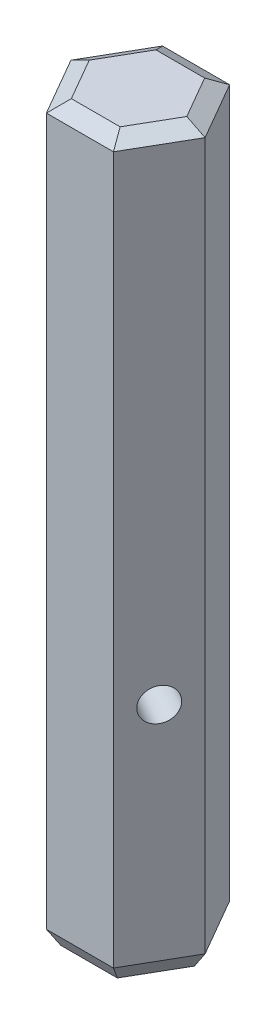
ISO-10303-21;
HEADER;
FILE_DESCRIPTION(('STEP AP214'),'2;1');
FILE_NAME('part.step','',(''),(''),'','','');
FILE_SCHEMA(('AUTOMOTIVE_DESIGN { 1 0 10303 214 1 1 1 1 }'));
ENDSEC;
DATA;
#1=APPLICATION_CONTEXT('core data for automotive mechanical design processes');
#2=APPLICATION_PROTOCOL_DEFINITION('international standard','automotive_design',2000,#1);
#3=PRODUCT_CONTEXT('',#1,'mechanical');
#4=PRODUCT('Part','Part','',(#3));
#5=PRODUCT_RELATED_PRODUCT_CATEGORY('part','',(#4));
#6=PRODUCT_DEFINITION_FORMATION('','',#4);
#7=PRODUCT_DEFINITION_CONTEXT('part definition',#1,'design');
#8=PRODUCT_DEFINITION('design','',#6,#7);
#9=PRODUCT_DEFINITION_SHAPE('','',#8);
#10=(LENGTH_UNIT() NAMED_UNIT(*) SI_UNIT(.MILLI.,.METRE.));
#11=(NAMED_UNIT(*) PLANE_ANGLE_UNIT() SI_UNIT($,.RADIAN.));
#12=(NAMED_UNIT(*) SI_UNIT($,.STERADIAN.) SOLID_ANGLE_UNIT());
#13=UNCERTAINTY_MEASURE_WITH_UNIT(LENGTH_MEASURE(1.E-05),#10,'distance_accuracy_value','');
#14=(GEOMETRIC_REPRESENTATION_CONTEXT(3) GLOBAL_UNCERTAINTY_ASSIGNED_CONTEXT((#13)) GLOBAL_UNIT_ASSIGNED_CONTEXT((#10,
#11,#12)) REPRESENTATION_CONTEXT('',''));
#15=CARTESIAN_POINT('',(0.,0.,0.));
#16=DIRECTION('',(0.,0.,1.));
#17=DIRECTION('',(1.,0.,0.));
#18=AXIS2_PLACEMENT_3D('',#15,#16,#17);
#19=CARTESIAN_POINT('',(1.8330871046771,40.,3.17499999999998));
#20=DIRECTION('',(-0.866025403784442,0.,-0.499999999999995));
#21=DIRECTION('',(-0.499999999999995,0.,0.866025403784442));
#22=AXIS2_PLACEMENT_3D('',#19,#20,#21);
#23=PLANE('',#22);
#24=CARTESIAN_POINT('',(2.74963065701561,13.,1.58749999999999));
#25=DIRECTION('',(0.866025403784441,0.,0.499999999999995));
#26=DIRECTION('',(0.499999999999995,0.,-0.866025403784442));
#27=AXIS2_PLACEMENT_3D('',#24,#25,#26);
#28=CIRCLE('',#27,0.9);
#29=CARTESIAN_POINT('',(3.19963065701561,13.,0.808077136593995));
#30=VERTEX_POINT('',#29);
#31=EDGE_CURVE('E549',#30,#30,#28,.T.);
#32=ORIENTED_EDGE('',*,*,#31,.F.);
#33=EDGE_LOOP('',(#32));
#34=FACE_BOUND('',#33,.T.);
#35=DIRECTION('',(0.,-1.,0.));
#36=VECTOR('',#35,1.);
#37=CARTESIAN_POINT('',(3.66617420935413,40.,0.));
#38=LINE('',#37,#36);
#39=CARTESIAN_POINT('',(3.66617420935413,39.5,0.));
#40=VERTEX_POINT('',#39);
#41=CARTESIAN_POINT('',(3.66617420935413,0.866025403784436,0.));
#42=VERTEX_POINT('',#41);
#43=EDGE_CURVE('E150',#40,#42,#38,.T.);
#44=ORIENTED_EDGE('',*,*,#43,.F.);
#45=DIRECTION('',(-0.499999999999995,0.,0.866025403784442));
#46=VECTOR('',#45,1.);
#47=CARTESIAN_POINT('',(1.8330871046771,39.5,3.17499999999998));
#48=LINE('',#47,#46);
#49=CARTESIAN_POINT('',(1.8330871046771,39.5,3.17499999999998));
#50=VERTEX_POINT('',#49);
#51=EDGE_CURVE('E183',#40,#50,#48,.T.);
#52=ORIENTED_EDGE('',*,*,#51,.T.);
#53=DIRECTION('',(0.,-1.,0.));
#54=VECTOR('',#53,1.);
#55=CARTESIAN_POINT('',(1.8330871046771,40.,3.17499999999998));
#56=LINE('',#55,#54);
#57=CARTESIAN_POINT('',(1.8330871046771,0.866025403784436,3.17499999999998));
#58=VERTEX_POINT('',#57);
#59=EDGE_CURVE('E204',#50,#58,#56,.T.);
#60=ORIENTED_EDGE('',*,*,#59,.T.);
#61=DIRECTION('',(0.499999999999995,0.,-0.866025403784442));
#62=VECTOR('',#61,1.);
#63=CARTESIAN_POINT('',(1.8330871046771,0.866025403784436,3.17499999999998));
#64=LINE('',#63,#62);
#65=EDGE_CURVE('E181',#58,#42,#64,.T.);
#66=ORIENTED_EDGE('',*,*,#65,.T.);
#67=EDGE_LOOP('',(#44,#52,#60,#66));
#68=FACE_BOUND('',#67,.T.);
#69=ADVANCED_FACE('F39',(#34,#68),#23,.F.);
#70=CARTESIAN_POINT('',(3.66617420935413,40.,0.));
#71=DIRECTION('',(-0.866025403784438,0.,0.500000000000001));
#72=DIRECTION('',(0.500000000000001,0.,0.866025403784438));
#73=AXIS2_PLACEMENT_3D('',#70,#71,#72);
#74=PLANE('',#73);
#75=DIRECTION('',(0.,-1.,0.));
#76=VECTOR('',#75,1.);
#77=CARTESIAN_POINT('',(1.83308710467706,40.,-3.17500000000001));
#78=LINE('',#77,#76);
#79=CARTESIAN_POINT('',(1.83308710467706,39.5,-3.17500000000001));
#80=VERTEX_POINT('',#79);
#81=CARTESIAN_POINT('',(1.83308710467706,0.866025403784436,-3.17500000000001));
#82=VERTEX_POINT('',#81);
#83=EDGE_CURVE('E245',#80,#82,#78,.T.);
#84=ORIENTED_EDGE('',*,*,#83,.F.);
#85=DIRECTION('',(0.500000000000001,0.,0.866025403784438));
#86=VECTOR('',#85,1.);
#87=CARTESIAN_POINT('',(3.66617420935413,39.5,0.));
#88=LINE('',#87,#86);
#89=EDGE_CURVE('E179',#80,#40,#88,.T.);
#90=ORIENTED_EDGE('',*,*,#89,.T.);
#91=ORIENTED_EDGE('',*,*,#43,.T.);
#92=DIRECTION('',(-0.500000000000001,0.,-0.866025403784438));
#93=VECTOR('',#92,1.);
#94=CARTESIAN_POINT('',(3.66617420935413,0.866025403784436,0.));
#95=LINE('',#94,#93);
#96=EDGE_CURVE('E176',#42,#82,#95,.T.);
#97=ORIENTED_EDGE('',*,*,#96,.T.);
#98=EDGE_LOOP('',(#84,#90,#91,#97));
#99=FACE_BOUND('',#98,.T.);
#100=ADVANCED_FACE('F242',(#99),#74,.F.);
#101=CARTESIAN_POINT('',(1.83308710467706,40.,-3.17500000000001));
#102=DIRECTION('',(0.,0.,1.));
#103=DIRECTION('',(1.,0.,0.));
#104=AXIS2_PLACEMENT_3D('',#101,#102,#103);
#105=PLANE('',#104);
#106=DIRECTION('',(0.,-1.,0.));
#107=VECTOR('',#106,1.);
#108=CARTESIAN_POINT('',(-1.83308710467708,40.,-3.17499999999999));
#109=LINE('',#108,#107);
#110=CARTESIAN_POINT('',(-1.83308710467708,39.5,-3.17499999999999));
#111=VERTEX_POINT('',#110);
#112=CARTESIAN_POINT('',(-1.83308710467708,0.866025403784436,-3.17499999999999));
#113=VERTEX_POINT('',#112);
#114=EDGE_CURVE('E247',#111,#113,#109,.T.);
#115=ORIENTED_EDGE('',*,*,#114,.F.);
#116=DIRECTION('',(1.,0.,0.));
#117=VECTOR('',#116,1.);
#118=CARTESIAN_POINT('',(1.83308710467706,39.5,-3.17500000000001));
#119=LINE('',#118,#117);
#120=EDGE_CURVE('E174',#111,#80,#119,.T.);
#121=ORIENTED_EDGE('',*,*,#120,.T.);
#122=ORIENTED_EDGE('',*,*,#83,.T.);
#123=DIRECTION('',(-1.,0.,0.));
#124=VECTOR('',#123,1.);
#125=CARTESIAN_POINT('',(1.83308710467706,0.866025403784436,-3.17500000000001));
#126=LINE('',#125,#124);
#127=EDGE_CURVE('E172',#82,#113,#126,.T.);
#128=ORIENTED_EDGE('',*,*,#127,.T.);
#129=EDGE_LOOP('',(#115,#121,#122,#128));
#130=FACE_BOUND('',#129,.T.);
#131=ADVANCED_FACE('F310',(#130),#105,.F.);
#132=CARTESIAN_POINT('',(-1.83308710467708,40.,-3.17499999999999));
#133=DIRECTION('',(0.866025403784442,0.,0.499999999999995));
#134=DIRECTION('',(0.499999999999995,0.,-0.866025403784442));
#135=AXIS2_PLACEMENT_3D('',#132,#133,#134);
#136=PLANE('',#135);
#137=CARTESIAN_POINT('',(-2.7496306570156,13.,-1.58749999999998));
#138=DIRECTION('',(0.866025403784442,0.,0.499999999999995));
#139=DIRECTION('',(0.499999999999995,0.,-0.866025403784442));
#140=AXIS2_PLACEMENT_3D('',#137,#138,#139);
#141=CIRCLE('',#140,0.9);
#142=CARTESIAN_POINT('',(-2.29963065701561,13.,-2.36692286340598));
#143=VERTEX_POINT('',#142);
#144=EDGE_CURVE('E44',#143,#143,#141,.T.);
#145=ORIENTED_EDGE('',*,*,#144,.T.);
#146=EDGE_LOOP('',(#145));
#147=FACE_BOUND('',#146,.T.);
#148=DIRECTION('',(0.,-1.,0.));
#149=VECTOR('',#148,1.);
#150=CARTESIAN_POINT('',(-3.66617420935413,40.,0.));
#151=LINE('',#150,#149);
#152=CARTESIAN_POINT('',(-3.66617420935413,39.5,0.));
#153=VERTEX_POINT('',#152);
#154=CARTESIAN_POINT('',(-3.66617420935413,0.866025403784436,0.));
#155=VERTEX_POINT('',#154);
#156=EDGE_CURVE('E272',#153,#155,#151,.T.);
#157=ORIENTED_EDGE('',*,*,#156,.F.);
#158=DIRECTION('',(0.499999999999995,0.,-0.866025403784442));
#159=VECTOR('',#158,1.);
#160=CARTESIAN_POINT('',(-1.83308710467708,39.5,-3.17499999999999));
#161=LINE('',#160,#159);
#162=EDGE_CURVE('E170',#153,#111,#161,.T.);
#163=ORIENTED_EDGE('',*,*,#162,.T.);
#164=ORIENTED_EDGE('',*,*,#114,.T.);
#165=DIRECTION('',(-0.499999999999995,0.,0.866025403784442));
#166=VECTOR('',#165,1.);
#167=CARTESIAN_POINT('',(-1.83308710467708,0.866025403784436,-3.17499999999999));
#168=LINE('',#167,#166);
#169=EDGE_CURVE('E168',#113,#155,#168,.T.);
#170=ORIENTED_EDGE('',*,*,#169,.T.);
#171=EDGE_LOOP('',(#157,#163,#164,#170));
#172=FACE_BOUND('',#171,.T.);
#173=ADVANCED_FACE('F281',(#147,#172),#136,.F.);
#174=CARTESIAN_POINT('',(-3.66617420935413,40.,0.));
#175=DIRECTION('',(0.866025403784435,0.,-0.500000000000007));
#176=DIRECTION('',(-0.500000000000007,0.,-0.866025403784435));
#177=AXIS2_PLACEMENT_3D('',#174,#175,#176);
#178=PLANE('',#177);
#179=DIRECTION('',(0.,-1.,0.));
#180=VECTOR('',#179,1.);
#181=CARTESIAN_POINT('',(-1.83308710467703,40.,3.17500000000002));
#182=LINE('',#181,#180);
#183=CARTESIAN_POINT('',(-1.83308710467703,39.5,3.17500000000002));
#184=VERTEX_POINT('',#183);
#185=CARTESIAN_POINT('',(-1.83308710467703,0.866025403784436,3.17500000000002));
#186=VERTEX_POINT('',#185);
#187=EDGE_CURVE('E270',#184,#186,#182,.T.);
#188=ORIENTED_EDGE('',*,*,#187,.F.);
#189=DIRECTION('',(-0.500000000000007,0.,-0.866025403784435));
#190=VECTOR('',#189,1.);
#191=CARTESIAN_POINT('',(-3.66617420935413,39.5,0.));
#192=LINE('',#191,#190);
#193=EDGE_CURVE('E166',#184,#153,#192,.T.);
#194=ORIENTED_EDGE('',*,*,#193,.T.);
#195=ORIENTED_EDGE('',*,*,#156,.T.);
#196=DIRECTION('',(0.500000000000007,0.,0.866025403784435));
#197=VECTOR('',#196,1.);
#198=CARTESIAN_POINT('',(-3.66617420935413,0.866025403784436,0.));
#199=LINE('',#198,#197);
#200=EDGE_CURVE('E164',#155,#186,#199,.T.);
#201=ORIENTED_EDGE('',*,*,#200,.T.);
#202=EDGE_LOOP('',(#188,#194,#195,#201));
#203=FACE_BOUND('',#202,.T.);
#204=ADVANCED_FACE('F271',(#203),#178,.F.);
#205=CARTESIAN_POINT('',(-1.83308710467703,40.,3.17500000000002));
#206=DIRECTION('',(0.,0.,-1.));
#207=DIRECTION('',(-1.,0.,0.));
#208=AXIS2_PLACEMENT_3D('',#205,#206,#207);
#209=PLANE('',#208);
#210=ORIENTED_EDGE('',*,*,#59,.F.);
#211=DIRECTION('',(-1.,0.,0.));
#212=VECTOR('',#211,1.);
#213=CARTESIAN_POINT('',(-1.83308710467703,39.5,3.17500000000002));
#214=LINE('',#213,#212);
#215=EDGE_CURVE('E136',#50,#184,#214,.T.);
#216=ORIENTED_EDGE('',*,*,#215,.T.);
#217=ORIENTED_EDGE('',*,*,#187,.T.);
#218=DIRECTION('',(1.,0.,0.));
#219=VECTOR('',#218,1.);
#220=CARTESIAN_POINT('',(-1.83308710467703,0.866025403784436,3.17500000000002));
#221=LINE('',#220,#219);
#222=EDGE_CURVE('E156',#186,#58,#221,.T.);
#223=ORIENTED_EDGE('',*,*,#222,.T.);
#224=EDGE_LOOP('',(#210,#216,#217,#223));
#225=FACE_BOUND('',#224,.T.);
#226=ADVANCED_FACE('F269',(#225),#209,.F.);
#227=CARTESIAN_POINT('',(0.,40.,0.));
#228=DIRECTION('',(0.,1.,0.));
#229=DIRECTION('',(0.,0.,1.));
#230=AXIS2_PLACEMENT_3D('',#227,#228,#229);
#231=PLANE('',#230);
#232=DIRECTION('',(0.500000000000007,0.,0.866025403784435));
#233=VECTOR('',#232,1.);
#234=CARTESIAN_POINT('',(-1.08308710467704,40.,2.74198729810779));
#235=LINE('',#234,#233);
#236=CARTESIAN_POINT('',(-2.66617420935413,40.,0.));
#237=VERTEX_POINT('',#236);
#238=CARTESIAN_POINT('',(-1.33308710467704,40.,2.30897459621558));
#239=VERTEX_POINT('',#238);
#240=EDGE_CURVE('E154',#237,#239,#235,.T.);
#241=ORIENTED_EDGE('',*,*,#240,.T.);
#242=DIRECTION('',(1.,0.,0.));
#243=VECTOR('',#242,1.);
#244=CARTESIAN_POINT('',(1.83308710467709,40.,2.30897459621554));
#245=LINE('',#244,#243);
#246=CARTESIAN_POINT('',(1.33308710467709,40.,2.30897459621555));
#247=VERTEX_POINT('',#246);
#248=EDGE_CURVE('E134',#239,#247,#245,.T.);
#249=ORIENTED_EDGE('',*,*,#248,.T.);
#250=DIRECTION('',(0.499999999999995,0.,-0.866025403784441));
#251=VECTOR('',#250,1.);
#252=CARTESIAN_POINT('',(2.91617420935413,40.,-0.433012701892214));
#253=LINE('',#252,#251);
#254=CARTESIAN_POINT('',(2.66617420935413,40.,0.));
#255=VERTEX_POINT('',#254);
#256=EDGE_CURVE('E143',#247,#255,#253,.T.);
#257=ORIENTED_EDGE('',*,*,#256,.T.);
#258=DIRECTION('',(-0.500000000000001,0.,-0.866025403784438));
#259=VECTOR('',#258,1.);
#260=CARTESIAN_POINT('',(1.08308710467706,40.,-2.74198729810779));
#261=LINE('',#260,#259);
#262=CARTESIAN_POINT('',(1.33308710467706,40.,-2.30897459621557));
#263=VERTEX_POINT('',#262);
#264=EDGE_CURVE('E149',#255,#263,#261,.T.);
#265=ORIENTED_EDGE('',*,*,#264,.T.);
#266=DIRECTION('',(-1.,0.,0.));
#267=VECTOR('',#266,1.);
#268=CARTESIAN_POINT('',(-1.83308710467707,40.,-2.30897459621556));
#269=LINE('',#268,#267);
#270=CARTESIAN_POINT('',(-1.33308710467707,40.,-2.30897459621556));
#271=VERTEX_POINT('',#270);
#272=EDGE_CURVE('E252',#263,#271,#269,.T.);
#273=ORIENTED_EDGE('',*,*,#272,.T.);
#274=DIRECTION('',(-0.499999999999995,0.,0.866025403784442));
#275=VECTOR('',#274,1.);
#276=CARTESIAN_POINT('',(-2.91617420935412,40.,0.43301270189224));
#277=LINE('',#276,#275);
#278=EDGE_CURVE('E159',#271,#237,#277,.T.);
#279=ORIENTED_EDGE('',*,*,#278,.T.);
#280=EDGE_LOOP('',(#241,#249,#257,#265,#273,#279));
#281=FACE_BOUND('',#280,.T.);
#282=ADVANCED_FACE('F152',(#281),#231,.T.);
#283=CARTESIAN_POINT('',(0.,0.,0.));
#284=DIRECTION('',(0.,1.,0.));
#285=DIRECTION('',(0.,0.,1.));
#286=AXIS2_PLACEMENT_3D('',#283,#284,#285);
#287=PLANE('',#286);
#288=DIRECTION('',(1.,0.,0.));
#289=VECTOR('',#288,1.);
#290=CARTESIAN_POINT('',(0.,0.,-2.675));
#291=LINE('',#290,#289);
#292=CARTESIAN_POINT('',(-1.54441197008226,0.,-2.67499999999999));
#293=VERTEX_POINT('',#292);
#294=CARTESIAN_POINT('',(1.54441197008224,0.,-2.67500000000001));
#295=VERTEX_POINT('',#294);
#296=EDGE_CURVE('E49',#293,#295,#291,.T.);
#297=ORIENTED_EDGE('',*,*,#296,.T.);
#298=DIRECTION('',(0.500000000000001,0.,0.866025403784438));
#299=VECTOR('',#298,1.);
#300=CARTESIAN_POINT('',(2.31661795512337,0.,-1.3375));
#301=LINE('',#300,#299);
#302=CARTESIAN_POINT('',(3.0888239401645,0.,0.));
#303=VERTEX_POINT('',#302);
#304=EDGE_CURVE('E11',#295,#303,#301,.T.);
#305=ORIENTED_EDGE('',*,*,#304,.T.);
#306=DIRECTION('',(-0.499999999999995,0.,0.866025403784441));
#307=VECTOR('',#306,1.);
#308=CARTESIAN_POINT('',(2.31661795512339,0.,1.33749999999999));
#309=LINE('',#308,#307);
#310=CARTESIAN_POINT('',(1.54441197008228,0.,2.67499999999998));
#311=VERTEX_POINT('',#310);
#312=EDGE_CURVE('E185',#303,#311,#309,.T.);
#313=ORIENTED_EDGE('',*,*,#312,.T.);
#314=DIRECTION('',(-1.,0.,0.));
#315=VECTOR('',#314,1.);
#316=CARTESIAN_POINT('',(0.,0.,2.675));
#317=LINE('',#316,#315);
#318=CARTESIAN_POINT('',(-1.54441197008222,0.,2.67500000000002));
#319=VERTEX_POINT('',#318);
#320=EDGE_CURVE('E187',#311,#319,#317,.T.);
#321=ORIENTED_EDGE('',*,*,#320,.T.);
#322=DIRECTION('',(-0.500000000000007,0.,-0.866025403784435));
#323=VECTOR('',#322,1.);
#324=CARTESIAN_POINT('',(-2.31661795512336,0.,1.33750000000002));
#325=LINE('',#324,#323);
#326=CARTESIAN_POINT('',(-3.0888239401645,0.,0.));
#327=VERTEX_POINT('',#326);
#328=EDGE_CURVE('E189',#319,#327,#325,.T.);
#329=ORIENTED_EDGE('',*,*,#328,.T.);
#330=DIRECTION('',(0.499999999999995,0.,-0.866025403784442));
#331=VECTOR('',#330,1.);
#332=CARTESIAN_POINT('',(-2.31661795512338,0.,-1.33749999999999));
#333=LINE('',#332,#331);
#334=EDGE_CURVE('E60',#327,#293,#333,.T.);
#335=ORIENTED_EDGE('',*,*,#334,.T.);
#336=EDGE_LOOP('',(#297,#305,#313,#321,#329,#335));
#337=FACE_BOUND('',#336,.T.);
#338=ADVANCED_FACE('F228',(#337),#287,.F.);
#339=CARTESIAN_POINT('',(0.,40.,-2.30897459621556));
#340=DIRECTION('',(0.,0.866025403784438,-0.500000000000001));
#341=DIRECTION('',(1.,0.,0.));
#342=AXIS2_PLACEMENT_3D('',#339,#340,#341);
#343=PLANE('',#342);
#344=DIRECTION('',(-0.447213595499956,0.447213595499959,0.774596669241484));
#345=VECTOR('',#344,1.);
#346=CARTESIAN_POINT('',(1.06646968374165,40.2666174209354,-1.84717967697245));
#347=LINE('',#346,#345);
#348=EDGE_CURVE('E198',#80,#263,#347,.T.);
#349=ORIENTED_EDGE('',*,*,#348,.F.);
#350=ORIENTED_EDGE('',*,*,#120,.F.);
#351=DIRECTION('',(0.447213595499961,0.447213595499959,0.774596669241481));
#352=VECTOR('',#351,1.);
#353=CARTESIAN_POINT('',(-1.06646968374166,40.2666174209354,-1.84717967697245));
#354=LINE('',#353,#352);
#355=EDGE_CURVE('E201',#271,#111,#354,.F.);
#356=ORIENTED_EDGE('',*,*,#355,.F.);
#357=ORIENTED_EDGE('',*,*,#272,.F.);
#358=EDGE_LOOP('',(#349,#350,#356,#357));
#359=FACE_BOUND('',#358,.T.);
#360=ADVANCED_FACE('F342',(#359),#343,.T.);
#361=CARTESIAN_POINT('',(-1.9996306570156,40.,-1.15448729810777));
#362=DIRECTION('',(-0.433012701892222,0.866025403784438,-0.249999999999998));
#363=DIRECTION('',(0.499999999999995,0.,-0.866025403784442));
#364=AXIS2_PLACEMENT_3D('',#361,#362,#363);
#365=PLANE('',#364);
#366=ORIENTED_EDGE('',*,*,#355,.T.);
#367=ORIENTED_EDGE('',*,*,#162,.F.);
#368=DIRECTION('',(0.894427190999915,0.447213595499959,0.));
#369=VECTOR('',#368,1.);
#370=CARTESIAN_POINT('',(-2.1329393674833,40.2666174209354,0.));
#371=LINE('',#370,#369);
#372=EDGE_CURVE('E195',#237,#153,#371,.F.);
#373=ORIENTED_EDGE('',*,*,#372,.F.);
#374=ORIENTED_EDGE('',*,*,#278,.F.);
#375=EDGE_LOOP('',(#366,#367,#373,#374));
#376=FACE_BOUND('',#375,.T.);
#377=ADVANCED_FACE('F259',(#376),#365,.T.);
#378=CARTESIAN_POINT('',(1.99963065701559,40.,-1.15448729810778));
#379=DIRECTION('',(0.43301270189222,0.866025403784438,-0.250000000000001));
#380=DIRECTION('',(0.500000000000001,0.,0.866025403784438));
#381=AXIS2_PLACEMENT_3D('',#378,#379,#380);
#382=PLANE('',#381);
#383=ORIENTED_EDGE('',*,*,#348,.T.);
#384=ORIENTED_EDGE('',*,*,#264,.F.);
#385=DIRECTION('',(-0.894427190999915,0.447213595499959,0.));
#386=VECTOR('',#385,1.);
#387=CARTESIAN_POINT('',(2.13293936748331,40.2666174209354,0.));
#388=LINE('',#387,#386);
#389=EDGE_CURVE('E146',#40,#255,#388,.T.);
#390=ORIENTED_EDGE('',*,*,#389,.F.);
#391=ORIENTED_EDGE('',*,*,#89,.F.);
#392=EDGE_LOOP('',(#383,#384,#390,#391));
#393=FACE_BOUND('',#392,.T.);
#394=ADVANCED_FACE('F331',(#393),#382,.T.);
#395=CARTESIAN_POINT('',(-1.99963065701558,40.,1.1544872981078));
#396=DIRECTION('',(-0.433012701892218,0.866025403784438,0.250000000000004));
#397=DIRECTION('',(-0.500000000000007,0.,-0.866025403784435));
#398=AXIS2_PLACEMENT_3D('',#395,#396,#397);
#399=PLANE('',#398);
#400=ORIENTED_EDGE('',*,*,#372,.T.);
#401=ORIENTED_EDGE('',*,*,#193,.F.);
#402=DIRECTION('',(0.447213595499951,0.447213595499959,-0.774596669241487));
#403=VECTOR('',#402,1.);
#404=CARTESIAN_POINT('',(-1.06646968374163,40.2666174209354,1.84717967697246));
#405=LINE('',#404,#403);
#406=EDGE_CURVE('E139',#239,#184,#405,.F.);
#407=ORIENTED_EDGE('',*,*,#406,.F.);
#408=ORIENTED_EDGE('',*,*,#240,.F.);
#409=EDGE_LOOP('',(#400,#401,#407,#408));
#410=FACE_BOUND('',#409,.T.);
#411=ADVANCED_FACE('F262',(#410),#399,.T.);
#412=CARTESIAN_POINT('',(1.99963065701561,40.,1.15448729810778));
#413=DIRECTION('',(0.433012701892222,0.866025403784438,0.249999999999998));
#414=DIRECTION('',(-0.499999999999995,0.,0.866025403784442));
#415=AXIS2_PLACEMENT_3D('',#412,#413,#414);
#416=PLANE('',#415);
#417=ORIENTED_EDGE('',*,*,#389,.T.);
#418=ORIENTED_EDGE('',*,*,#256,.F.);
#419=DIRECTION('',(0.447213595499964,-0.447213595499959,0.774596669241479));
#420=VECTOR('',#419,1.);
#421=CARTESIAN_POINT('',(1.06646968374168,40.2666174209354,1.84717967697245));
#422=LINE('',#421,#420);
#423=EDGE_CURVE('E130',#50,#247,#422,.F.);
#424=ORIENTED_EDGE('',*,*,#423,.F.);
#425=ORIENTED_EDGE('',*,*,#51,.F.);
#426=EDGE_LOOP('',(#417,#418,#424,#425));
#427=FACE_BOUND('',#426,.T.);
#428=ADVANCED_FACE('F144',(#427),#416,.T.);
#429=CARTESIAN_POINT('',(0.,40.,2.30897459621556));
#430=DIRECTION('',(0.,0.866025403784438,0.500000000000001));
#431=DIRECTION('',(-1.,0.,0.));
#432=AXIS2_PLACEMENT_3D('',#429,#430,#431);
#433=PLANE('',#432);
#434=ORIENTED_EDGE('',*,*,#406,.T.);
#435=ORIENTED_EDGE('',*,*,#215,.F.);
#436=ORIENTED_EDGE('',*,*,#423,.T.);
#437=ORIENTED_EDGE('',*,*,#248,.F.);
#438=EDGE_LOOP('',(#434,#435,#436,#437));
#439=FACE_BOUND('',#438,.T.);
#440=ADVANCED_FACE('F132',(#439),#433,.T.);
#441=CARTESIAN_POINT('',(-3.66617420935413,0.866025403784436,0.));
#442=DIRECTION('',(0.749999999999996,0.500000000000002,-0.433012701892225));
#443=DIRECTION('',(0.500000000000007,0.,0.866025403784435));
#444=AXIS2_PLACEMENT_3D('',#441,#442,#443);
#445=PLANE('',#444);
#446=DIRECTION('',(0.554700196225231,-0.832050294337842,0.));
#447=VECTOR('',#446,1.);
#448=CARTESIAN_POINT('',(-3.66617420935413,0.866025403784436,0.));
#449=LINE('',#448,#447);
#450=EDGE_CURVE('E215',#327,#155,#449,.F.);
#451=ORIENTED_EDGE('',*,*,#450,.F.);
#452=ORIENTED_EDGE('',*,*,#328,.F.);
#453=DIRECTION('',(0.277350098112612,-0.832050294337842,-0.480384461415266));
#454=VECTOR('',#453,1.);
#455=CARTESIAN_POINT('',(-1.83308710467703,0.866025403784436,3.17500000000002));
#456=LINE('',#455,#454);
#457=EDGE_CURVE('E140',#186,#319,#456,.T.);
#458=ORIENTED_EDGE('',*,*,#457,.F.);
#459=ORIENTED_EDGE('',*,*,#200,.F.);
#460=EDGE_LOOP('',(#451,#452,#458,#459));
#461=FACE_BOUND('',#460,.T.);
#462=ADVANCED_FACE('F42',(#461),#445,.F.);
#463=CARTESIAN_POINT('',(-1.83308710467703,0.866025403784436,3.17500000000002));
#464=DIRECTION('',(0.,0.500000000000002,-0.866025403784438));
#465=DIRECTION('',(1.,0.,0.));
#466=AXIS2_PLACEMENT_3D('',#463,#464,#465);
#467=PLANE('',#466);
#468=ORIENTED_EDGE('',*,*,#457,.T.);
#469=ORIENTED_EDGE('',*,*,#320,.F.);
#470=DIRECTION('',(-0.277350098112619,-0.832050294337843,-0.48038446141526));
#471=VECTOR('',#470,1.);
#472=CARTESIAN_POINT('',(1.8330871046771,0.866025403784436,3.17499999999998));
#473=LINE('',#472,#471);
#474=EDGE_CURVE('E212',#58,#311,#473,.T.);
#475=ORIENTED_EDGE('',*,*,#474,.F.);
#476=ORIENTED_EDGE('',*,*,#222,.F.);
#477=EDGE_LOOP('',(#468,#469,#475,#476));
#478=FACE_BOUND('',#477,.T.);
#479=ADVANCED_FACE('F222',(#478),#467,.F.);
#480=CARTESIAN_POINT('',(-1.83308710467708,0.866025403784436,-3.17499999999999));
#481=DIRECTION('',(0.750000000000002,0.500000000000001,0.433012701892214));
#482=DIRECTION('',(-0.499999999999995,0.,0.866025403784442));
#483=AXIS2_PLACEMENT_3D('',#480,#481,#482);
#484=PLANE('',#483);
#485=ORIENTED_EDGE('',*,*,#450,.T.);
#486=ORIENTED_EDGE('',*,*,#169,.F.);
#487=DIRECTION('',(0.277350098112618,-0.832050294337842,0.480384461415262));
#488=VECTOR('',#487,1.);
#489=CARTESIAN_POINT('',(-1.83308710467708,0.866025403784436,-3.17499999999999));
#490=LINE('',#489,#488);
#491=EDGE_CURVE('E209',#293,#113,#490,.F.);
#492=ORIENTED_EDGE('',*,*,#491,.F.);
#493=ORIENTED_EDGE('',*,*,#334,.F.);
#494=EDGE_LOOP('',(#485,#486,#492,#493));
#495=FACE_BOUND('',#494,.T.);
#496=ADVANCED_FACE('F285',(#495),#484,.F.);
#497=CARTESIAN_POINT('',(1.8330871046771,0.866025403784436,3.17499999999998));
#498=DIRECTION('',(-0.750000000000002,0.500000000000001,-0.433012701892215));
#499=DIRECTION('',(0.499999999999995,0.,-0.866025403784442));
#500=AXIS2_PLACEMENT_3D('',#497,#498,#499);
#501=PLANE('',#500);
#502=ORIENTED_EDGE('',*,*,#474,.T.);
#503=ORIENTED_EDGE('',*,*,#312,.F.);
#504=DIRECTION('',(0.55470019622523,0.832050294337843,0.));
#505=VECTOR('',#504,1.);
#506=CARTESIAN_POINT('',(3.10214740791504,0.019985201625802,0.));
#507=LINE('',#506,#505);
#508=EDGE_CURVE('E207',#42,#303,#507,.F.);
#509=ORIENTED_EDGE('',*,*,#508,.F.);
#510=ORIENTED_EDGE('',*,*,#65,.F.);
#511=EDGE_LOOP('',(#502,#503,#509,#510));
#512=FACE_BOUND('',#511,.T.);
#513=ADVANCED_FACE('F232',(#512),#501,.F.);
#514=CARTESIAN_POINT('',(1.83308710467706,0.866025403784436,-3.17500000000001));
#515=DIRECTION('',(0.,0.500000000000002,0.866025403784438));
#516=DIRECTION('',(-1.,0.,0.));
#517=AXIS2_PLACEMENT_3D('',#514,#515,#516);
#518=PLANE('',#517);
#519=ORIENTED_EDGE('',*,*,#491,.T.);
#520=ORIENTED_EDGE('',*,*,#127,.F.);
#521=DIRECTION('',(-0.277350098112614,-0.832050294337842,0.480384461415264));
#522=VECTOR('',#521,1.);
#523=CARTESIAN_POINT('',(1.83308710467706,0.866025403784436,-3.17500000000001));
#524=LINE('',#523,#522);
#525=EDGE_CURVE('E205',#295,#82,#524,.F.);
#526=ORIENTED_EDGE('',*,*,#525,.F.);
#527=ORIENTED_EDGE('',*,*,#296,.F.);
#528=EDGE_LOOP('',(#519,#520,#526,#527));
#529=FACE_BOUND('',#528,.T.);
#530=ADVANCED_FACE('F288',(#529),#518,.F.);
#531=CARTESIAN_POINT('',(3.66617420935413,0.866025403784436,0.));
#532=DIRECTION('',(-0.749999999999999,0.500000000000001,0.43301270189222));
#533=DIRECTION('',(-0.500000000000001,0.,-0.866025403784438));
#534=AXIS2_PLACEMENT_3D('',#531,#532,#533);
#535=PLANE('',#534);
#536=ORIENTED_EDGE('',*,*,#508,.T.);
#537=ORIENTED_EDGE('',*,*,#304,.F.);
#538=ORIENTED_EDGE('',*,*,#525,.T.);
#539=ORIENTED_EDGE('',*,*,#96,.F.);
#540=EDGE_LOOP('',(#536,#537,#538,#539));
#541=FACE_BOUND('',#540,.T.);
#542=ADVANCED_FACE('F291',(#541),#535,.F.);
#543=CARTESIAN_POINT('',(-4.1244459855234,13.,-2.38124999999998));
#544=DIRECTION('',(0.866025403784442,0.,0.499999999999995));
#545=DIRECTION('',(0.499999999999995,0.,-0.866025403784442));
#546=AXIS2_PLACEMENT_3D('',#543,#544,#545);
#547=CYLINDRICAL_SURFACE('',#546,0.9);
#548=ORIENTED_EDGE('',*,*,#31,.T.);
#549=EDGE_LOOP('',(#548));
#550=FACE_BOUND('',#549,.T.);
#551=ORIENTED_EDGE('',*,*,#144,.F.);
#552=EDGE_LOOP('',(#551));
#553=FACE_BOUND('',#552,.T.);
#554=ADVANCED_FACE('F293',(#550,#553),#547,.F.);
#555=CLOSED_SHELL('',(#69,#100,#131,#173,#204,#226,#282,#338,#360,#377,#394,#411,#428,#440,#462,
#479,#496,#513,#530,#542,#554));
#556=MANIFOLD_SOLID_BREP('B2',#555);
#557=ADVANCED_BREP_SHAPE_REPRESENTATION('',(#18,#556),#14);
#558=SHAPE_DEFINITION_REPRESENTATION(#9,#557);
ENDSEC;
END-ISO-10303-21;
